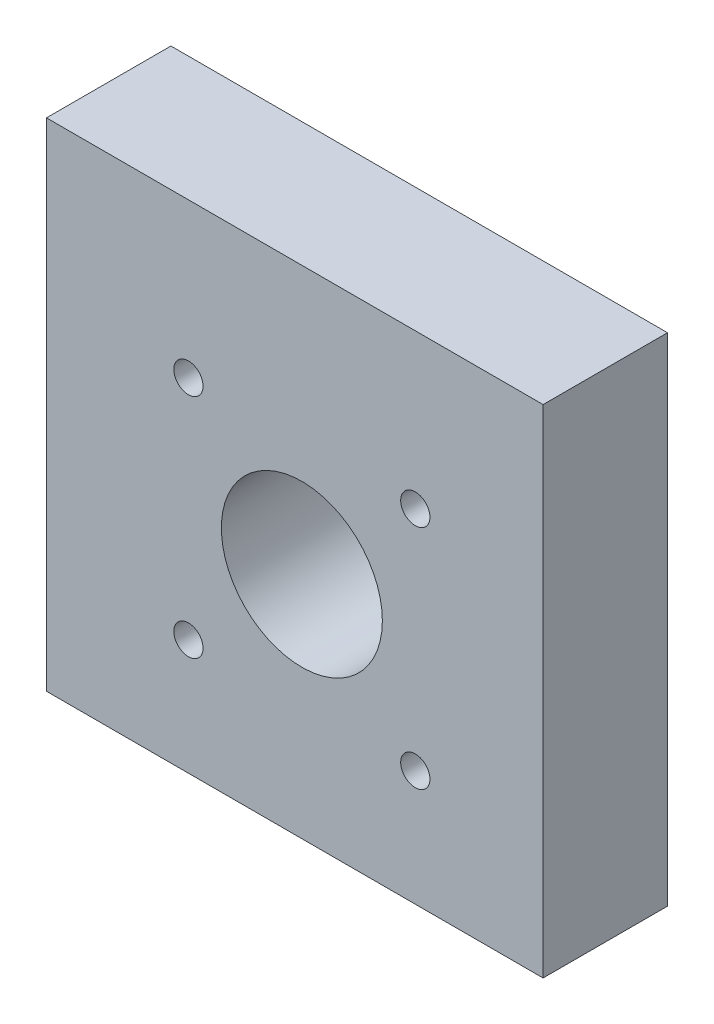
ISO-10303-21;
HEADER;
FILE_DESCRIPTION(('STEP AP214'),'2;1');
FILE_NAME('part.step','',(''),(''),'','','');
FILE_SCHEMA(('AUTOMOTIVE_DESIGN { 1 0 10303 214 1 1 1 1 }'));
ENDSEC;
DATA;
#1=APPLICATION_CONTEXT('core data for automotive mechanical design processes');
#2=APPLICATION_PROTOCOL_DEFINITION('international standard','automotive_design',2000,#1);
#3=PRODUCT_CONTEXT('',#1,'mechanical');
#4=PRODUCT('Part','Part','',(#3));
#5=PRODUCT_RELATED_PRODUCT_CATEGORY('part','',(#4));
#6=PRODUCT_DEFINITION_FORMATION('','',#4);
#7=PRODUCT_DEFINITION_CONTEXT('part definition',#1,'design');
#8=PRODUCT_DEFINITION('design','',#6,#7);
#9=PRODUCT_DEFINITION_SHAPE('','',#8);
#10=(LENGTH_UNIT() NAMED_UNIT(*) SI_UNIT(.MILLI.,.METRE.));
#11=(NAMED_UNIT(*) PLANE_ANGLE_UNIT() SI_UNIT($,.RADIAN.));
#12=(NAMED_UNIT(*) SI_UNIT($,.STERADIAN.) SOLID_ANGLE_UNIT());
#13=UNCERTAINTY_MEASURE_WITH_UNIT(LENGTH_MEASURE(1.E-05),#10,'distance_accuracy_value','');
#14=(GEOMETRIC_REPRESENTATION_CONTEXT(3) GLOBAL_UNCERTAINTY_ASSIGNED_CONTEXT((#13)) GLOBAL_UNIT_ASSIGNED_CONTEXT((#10,
#11,#12)) REPRESENTATION_CONTEXT('',''));
#15=CARTESIAN_POINT('',(0.,0.,0.));
#16=DIRECTION('',(0.,0.,1.));
#17=DIRECTION('',(1.,0.,0.));
#18=AXIS2_PLACEMENT_3D('',#15,#16,#17);
#19=CARTESIAN_POINT('',(-34.8929680603324,-31.2892721732176,-17.));
#20=DIRECTION('',(-1.,0.,0.));
#21=DIRECTION('',(0.,0.,1.));
#22=AXIS2_PLACEMENT_3D('',#19,#20,#21);
#23=PLANE('',#22);
#24=DIRECTION('',(0.,-1.,0.));
#25=VECTOR('',#24,1.);
#26=CARTESIAN_POINT('',(-34.8929680603324,-31.2892721732176,0.));
#27=LINE('',#26,#25);
#28=CARTESIAN_POINT('',(-34.8929680603324,36.5634296567981,0.));
#29=VERTEX_POINT('',#28);
#30=CARTESIAN_POINT('',(-34.8929680603324,-31.2892721732176,0.));
#31=VERTEX_POINT('',#30);
#32=EDGE_CURVE('E118',#29,#31,#27,.T.);
#33=ORIENTED_EDGE('',*,*,#32,.F.);
#34=DIRECTION('',(0.,0.,1.));
#35=VECTOR('',#34,1.);
#36=CARTESIAN_POINT('',(-34.8929680603324,36.5634296567981,-17.));
#37=LINE('',#36,#35);
#38=CARTESIAN_POINT('',(-34.8929680603324,36.5634296567981,-17.));
#39=VERTEX_POINT('',#38);
#40=EDGE_CURVE('E12',#39,#29,#37,.T.);
#41=ORIENTED_EDGE('',*,*,#40,.F.);
#42=DIRECTION('',(0.,-1.,0.));
#43=VECTOR('',#42,1.);
#44=CARTESIAN_POINT('',(-34.8929680603324,-31.2892721732176,-17.));
#45=LINE('',#44,#43);
#46=CARTESIAN_POINT('',(-34.8929680603324,-31.2892721732176,-17.));
#47=VERTEX_POINT('',#46);
#48=EDGE_CURVE('E109',#39,#47,#45,.T.);
#49=ORIENTED_EDGE('',*,*,#48,.T.);
#50=DIRECTION('',(0.,0.,1.));
#51=VECTOR('',#50,1.);
#52=CARTESIAN_POINT('',(-34.8929680603324,-31.2892721732176,-17.));
#53=LINE('',#52,#51);
#54=EDGE_CURVE('E50',#47,#31,#53,.T.);
#55=ORIENTED_EDGE('',*,*,#54,.T.);
#56=EDGE_LOOP('',(#33,#41,#49,#55));
#57=FACE_BOUND('',#56,.T.);
#58=ADVANCED_FACE('F47',(#57),#23,.T.);
#59=CARTESIAN_POINT('',(-34.8929680603324,36.5634296567981,-17.));
#60=DIRECTION('',(0.,1.,0.));
#61=DIRECTION('',(-1.,0.,0.));
#62=AXIS2_PLACEMENT_3D('',#59,#60,#61);
#63=PLANE('',#62);
#64=DIRECTION('',(-1.,0.,0.));
#65=VECTOR('',#64,1.);
#66=CARTESIAN_POINT('',(-34.8929680603324,36.5634296567981,0.));
#67=LINE('',#66,#65);
#68=CARTESIAN_POINT('',(32.9597337696832,36.563429656798,0.));
#69=VERTEX_POINT('',#68);
#70=EDGE_CURVE('E112',#69,#29,#67,.T.);
#71=ORIENTED_EDGE('',*,*,#70,.F.);
#72=DIRECTION('',(0.,0.,1.));
#73=VECTOR('',#72,1.);
#74=CARTESIAN_POINT('',(32.9597337696832,36.563429656798,-17.));
#75=LINE('',#74,#73);
#76=CARTESIAN_POINT('',(32.9597337696832,36.563429656798,-17.));
#77=VERTEX_POINT('',#76);
#78=EDGE_CURVE('E57',#77,#69,#75,.T.);
#79=ORIENTED_EDGE('',*,*,#78,.F.);
#80=DIRECTION('',(-1.,0.,0.));
#81=VECTOR('',#80,1.);
#82=CARTESIAN_POINT('',(-34.8929680603324,36.5634296567981,-17.));
#83=LINE('',#82,#81);
#84=EDGE_CURVE('E104',#77,#39,#83,.T.);
#85=ORIENTED_EDGE('',*,*,#84,.T.);
#86=ORIENTED_EDGE('',*,*,#40,.T.);
#87=EDGE_LOOP('',(#71,#79,#85,#86));
#88=FACE_BOUND('',#87,.T.);
#89=ADVANCED_FACE('F142',(#88),#63,.T.);
#90=CARTESIAN_POINT('',(32.9597337696832,36.563429656798,-17.));
#91=DIRECTION('',(1.,0.,0.));
#92=DIRECTION('',(0.,0.,-1.));
#93=AXIS2_PLACEMENT_3D('',#90,#91,#92);
#94=PLANE('',#93);
#95=DIRECTION('',(0.,1.,0.));
#96=VECTOR('',#95,1.);
#97=CARTESIAN_POINT('',(32.9597337696832,36.563429656798,0.));
#98=LINE('',#97,#96);
#99=CARTESIAN_POINT('',(32.9597337696832,-31.2892721732177,0.));
#100=VERTEX_POINT('',#99);
#101=EDGE_CURVE('E98',#100,#69,#98,.T.);
#102=ORIENTED_EDGE('',*,*,#101,.F.);
#103=DIRECTION('',(0.,0.,1.));
#104=VECTOR('',#103,1.);
#105=CARTESIAN_POINT('',(32.9597337696832,-31.2892721732177,-17.));
#106=LINE('',#105,#104);
#107=CARTESIAN_POINT('',(32.9597337696832,-31.2892721732177,-17.));
#108=VERTEX_POINT('',#107);
#109=EDGE_CURVE('E93',#108,#100,#106,.T.);
#110=ORIENTED_EDGE('',*,*,#109,.F.);
#111=DIRECTION('',(0.,1.,0.));
#112=VECTOR('',#111,1.);
#113=CARTESIAN_POINT('',(32.9597337696832,36.563429656798,-17.));
#114=LINE('',#113,#112);
#115=EDGE_CURVE('E96',#108,#77,#114,.T.);
#116=ORIENTED_EDGE('',*,*,#115,.T.);
#117=ORIENTED_EDGE('',*,*,#78,.T.);
#118=EDGE_LOOP('',(#102,#110,#116,#117));
#119=FACE_BOUND('',#118,.T.);
#120=ADVANCED_FACE('F95',(#119),#94,.T.);
#121=CARTESIAN_POINT('',(32.9597337696832,-31.2892721732177,-17.));
#122=DIRECTION('',(0.,-1.,0.));
#123=DIRECTION('',(1.,0.,0.));
#124=AXIS2_PLACEMENT_3D('',#121,#122,#123);
#125=PLANE('',#124);
#126=DIRECTION('',(1.,0.,0.));
#127=VECTOR('',#126,1.);
#128=CARTESIAN_POINT('',(32.9597337696832,-31.2892721732177,0.));
#129=LINE('',#128,#127);
#130=EDGE_CURVE('E123',#31,#100,#129,.T.);
#131=ORIENTED_EDGE('',*,*,#130,.F.);
#132=ORIENTED_EDGE('',*,*,#54,.F.);
#133=DIRECTION('',(1.,0.,0.));
#134=VECTOR('',#133,1.);
#135=CARTESIAN_POINT('',(32.9597337696832,-31.2892721732177,-17.));
#136=LINE('',#135,#134);
#137=EDGE_CURVE('E103',#47,#108,#136,.T.);
#138=ORIENTED_EDGE('',*,*,#137,.T.);
#139=ORIENTED_EDGE('',*,*,#109,.T.);
#140=EDGE_LOOP('',(#131,#132,#138,#139));
#141=FACE_BOUND('',#140,.T.);
#142=ADVANCED_FACE('F107',(#141),#125,.T.);
#143=CARTESIAN_POINT('',(0.,0.,-17.));
#144=DIRECTION('',(0.,0.,-1.));
#145=DIRECTION('',(-1.,0.,0.));
#146=AXIS2_PLACEMENT_3D('',#143,#144,#145);
#147=PLANE('',#146);
#148=CARTESIAN_POINT('',(15.5000000000002,15.5000000000002,-17.));
#149=DIRECTION('',(0.,0.,1.));
#150=DIRECTION('',(1.,0.,0.));
#151=AXIS2_PLACEMENT_3D('',#148,#149,#150);
#152=CIRCLE('',#151,2.);
#153=CARTESIAN_POINT('',(17.5000000000002,15.5000000000002,-17.));
#154=VERTEX_POINT('',#153);
#155=EDGE_CURVE('E202',#154,#154,#152,.T.);
#156=ORIENTED_EDGE('',*,*,#155,.T.);
#157=EDGE_LOOP('',(#156));
#158=FACE_BOUND('',#157,.T.);
#159=CARTESIAN_POINT('',(-15.5000000000002,-15.4999999999999,-17.));
#160=DIRECTION('',(0.,0.,1.));
#161=DIRECTION('',(1.,0.,0.));
#162=AXIS2_PLACEMENT_3D('',#159,#160,#161);
#163=CIRCLE('',#162,2.);
#164=CARTESIAN_POINT('',(-13.5000000000002,-15.4999999999999,-17.));
#165=VERTEX_POINT('',#164);
#166=EDGE_CURVE('E216',#165,#165,#163,.T.);
#167=ORIENTED_EDGE('',*,*,#166,.T.);
#168=EDGE_LOOP('',(#167));
#169=FACE_BOUND('',#168,.T.);
#170=CARTESIAN_POINT('',(15.5,-15.5,-17.));
#171=DIRECTION('',(0.,0.,1.));
#172=DIRECTION('',(1.,0.,0.));
#173=AXIS2_PLACEMENT_3D('',#170,#171,#172);
#174=CIRCLE('',#173,2.);
#175=CARTESIAN_POINT('',(17.5,-15.5,-17.));
#176=VERTEX_POINT('',#175);
#177=EDGE_CURVE('E189',#176,#176,#174,.T.);
#178=ORIENTED_EDGE('',*,*,#177,.T.);
#179=EDGE_LOOP('',(#178));
#180=FACE_BOUND('',#179,.T.);
#181=CARTESIAN_POINT('',(-15.5,15.5000000000002,-17.));
#182=DIRECTION('',(0.,0.,1.));
#183=DIRECTION('',(1.,0.,0.));
#184=AXIS2_PLACEMENT_3D('',#181,#182,#183);
#185=CIRCLE('',#184,2.);
#186=CARTESIAN_POINT('',(-13.5,15.5000000000002,-17.));
#187=VERTEX_POINT('',#186);
#188=EDGE_CURVE('E227',#187,#187,#185,.T.);
#189=ORIENTED_EDGE('',*,*,#188,.T.);
#190=EDGE_LOOP('',(#189));
#191=FACE_BOUND('',#190,.T.);
#192=CARTESIAN_POINT('',(0.,0.,-17.));
#193=DIRECTION('',(0.,0.,1.));
#194=DIRECTION('',(1.,0.,0.));
#195=AXIS2_PLACEMENT_3D('',#192,#193,#194);
#196=CIRCLE('',#195,11.);
#197=CARTESIAN_POINT('',(11.,0.,-17.));
#198=VERTEX_POINT('',#197);
#199=EDGE_CURVE('E124',#198,#198,#196,.T.);
#200=ORIENTED_EDGE('',*,*,#199,.T.);
#201=EDGE_LOOP('',(#200));
#202=FACE_BOUND('',#201,.T.);
#203=ORIENTED_EDGE('',*,*,#48,.F.);
#204=ORIENTED_EDGE('',*,*,#84,.F.);
#205=ORIENTED_EDGE('',*,*,#115,.F.);
#206=ORIENTED_EDGE('',*,*,#137,.F.);
#207=EDGE_LOOP('',(#203,#204,#205,#206));
#208=FACE_BOUND('',#207,.T.);
#209=ADVANCED_FACE('F102',(#158,#169,#180,#191,#202,#208),#147,.T.);
#210=CARTESIAN_POINT('',(0.,0.,0.));
#211=DIRECTION('',(0.,0.,-1.));
#212=DIRECTION('',(-1.,0.,0.));
#213=AXIS2_PLACEMENT_3D('',#210,#211,#212);
#214=PLANE('',#213);
#215=CARTESIAN_POINT('',(15.5000000000002,15.5000000000002,0.));
#216=DIRECTION('',(0.,0.,1.));
#217=DIRECTION('',(1.,0.,0.));
#218=AXIS2_PLACEMENT_3D('',#215,#216,#217);
#219=CIRCLE('',#218,2.);
#220=CARTESIAN_POINT('',(17.5000000000002,15.5000000000002,0.));
#221=VERTEX_POINT('',#220);
#222=EDGE_CURVE('E211',#221,#221,#219,.T.);
#223=ORIENTED_EDGE('',*,*,#222,.F.);
#224=EDGE_LOOP('',(#223));
#225=FACE_BOUND('',#224,.T.);
#226=CARTESIAN_POINT('',(-15.5000000000002,-15.4999999999999,0.));
#227=DIRECTION('',(0.,0.,1.));
#228=DIRECTION('',(1.,0.,0.));
#229=AXIS2_PLACEMENT_3D('',#226,#227,#228);
#230=CIRCLE('',#229,2.);
#231=CARTESIAN_POINT('',(-13.5000000000002,-15.4999999999999,0.));
#232=VERTEX_POINT('',#231);
#233=EDGE_CURVE('E197',#232,#232,#230,.T.);
#234=ORIENTED_EDGE('',*,*,#233,.F.);
#235=EDGE_LOOP('',(#234));
#236=FACE_BOUND('',#235,.T.);
#237=CARTESIAN_POINT('',(15.5,-15.5,0.));
#238=DIRECTION('',(0.,0.,1.));
#239=DIRECTION('',(1.,0.,0.));
#240=AXIS2_PLACEMENT_3D('',#237,#238,#239);
#241=CIRCLE('',#240,2.);
#242=CARTESIAN_POINT('',(17.5,-15.5,0.));
#243=VERTEX_POINT('',#242);
#244=EDGE_CURVE('E192',#243,#243,#241,.T.);
#245=ORIENTED_EDGE('',*,*,#244,.F.);
#246=EDGE_LOOP('',(#245));
#247=FACE_BOUND('',#246,.T.);
#248=CARTESIAN_POINT('',(-15.5,15.5000000000002,0.));
#249=DIRECTION('',(0.,0.,1.));
#250=DIRECTION('',(1.,0.,0.));
#251=AXIS2_PLACEMENT_3D('',#248,#249,#250);
#252=CIRCLE('',#251,2.);
#253=CARTESIAN_POINT('',(-13.5,15.5000000000002,0.));
#254=VERTEX_POINT('',#253);
#255=EDGE_CURVE('E232',#254,#254,#252,.T.);
#256=ORIENTED_EDGE('',*,*,#255,.F.);
#257=EDGE_LOOP('',(#256));
#258=FACE_BOUND('',#257,.T.);
#259=CARTESIAN_POINT('',(0.,0.,0.));
#260=DIRECTION('',(0.,0.,1.));
#261=DIRECTION('',(1.,0.,0.));
#262=AXIS2_PLACEMENT_3D('',#259,#260,#261);
#263=CIRCLE('',#262,11.);
#264=CARTESIAN_POINT('',(11.,0.,0.));
#265=VERTEX_POINT('',#264);
#266=EDGE_CURVE('E231',#265,#265,#263,.T.);
#267=ORIENTED_EDGE('',*,*,#266,.F.);
#268=EDGE_LOOP('',(#267));
#269=FACE_BOUND('',#268,.T.);
#270=ORIENTED_EDGE('',*,*,#32,.T.);
#271=ORIENTED_EDGE('',*,*,#130,.T.);
#272=ORIENTED_EDGE('',*,*,#101,.T.);
#273=ORIENTED_EDGE('',*,*,#70,.T.);
#274=EDGE_LOOP('',(#270,#271,#272,#273));
#275=FACE_BOUND('',#274,.T.);
#276=ADVANCED_FACE('F141',(#225,#236,#247,#258,#269,#275),#214,.F.);
#277=CARTESIAN_POINT('',(0.,0.,-17.));
#278=DIRECTION('',(0.,0.,1.));
#279=DIRECTION('',(1.,0.,0.));
#280=AXIS2_PLACEMENT_3D('',#277,#278,#279);
#281=CYLINDRICAL_SURFACE('',#280,11.);
#282=ORIENTED_EDGE('',*,*,#199,.F.);
#283=EDGE_LOOP('',(#282));
#284=FACE_BOUND('',#283,.T.);
#285=ORIENTED_EDGE('',*,*,#266,.T.);
#286=EDGE_LOOP('',(#285));
#287=FACE_BOUND('',#286,.T.);
#288=ADVANCED_FACE('F160',(#284,#287),#281,.F.);
#289=CARTESIAN_POINT('',(-15.5,15.5000000000002,-17.));
#290=DIRECTION('',(0.,0.,1.));
#291=DIRECTION('',(1.,0.,0.));
#292=AXIS2_PLACEMENT_3D('',#289,#290,#291);
#293=CYLINDRICAL_SURFACE('',#292,2.);
#294=ORIENTED_EDGE('',*,*,#188,.F.);
#295=EDGE_LOOP('',(#294));
#296=FACE_BOUND('',#295,.T.);
#297=ORIENTED_EDGE('',*,*,#255,.T.);
#298=EDGE_LOOP('',(#297));
#299=FACE_BOUND('',#298,.T.);
#300=ADVANCED_FACE('F168',(#296,#299),#293,.F.);
#301=CARTESIAN_POINT('',(15.5,-15.5,-17.));
#302=DIRECTION('',(0.,0.,1.));
#303=DIRECTION('',(1.,0.,0.));
#304=AXIS2_PLACEMENT_3D('',#301,#302,#303);
#305=CYLINDRICAL_SURFACE('',#304,2.);
#306=ORIENTED_EDGE('',*,*,#177,.F.);
#307=EDGE_LOOP('',(#306));
#308=FACE_BOUND('',#307,.T.);
#309=ORIENTED_EDGE('',*,*,#244,.T.);
#310=EDGE_LOOP('',(#309));
#311=FACE_BOUND('',#310,.T.);
#312=ADVANCED_FACE('F172',(#308,#311),#305,.F.);
#313=CARTESIAN_POINT('',(-15.5000000000002,-15.4999999999999,-17.));
#314=DIRECTION('',(0.,0.,1.));
#315=DIRECTION('',(1.,0.,0.));
#316=AXIS2_PLACEMENT_3D('',#313,#314,#315);
#317=CYLINDRICAL_SURFACE('',#316,2.);
#318=ORIENTED_EDGE('',*,*,#166,.F.);
#319=EDGE_LOOP('',(#318));
#320=FACE_BOUND('',#319,.T.);
#321=ORIENTED_EDGE('',*,*,#233,.T.);
#322=EDGE_LOOP('',(#321));
#323=FACE_BOUND('',#322,.T.);
#324=ADVANCED_FACE('F174',(#320,#323),#317,.F.);
#325=CARTESIAN_POINT('',(15.5000000000002,15.5000000000002,-17.));
#326=DIRECTION('',(0.,0.,1.));
#327=DIRECTION('',(1.,0.,0.));
#328=AXIS2_PLACEMENT_3D('',#325,#326,#327);
#329=CYLINDRICAL_SURFACE('',#328,2.);
#330=ORIENTED_EDGE('',*,*,#155,.F.);
#331=EDGE_LOOP('',(#330));
#332=FACE_BOUND('',#331,.T.);
#333=ORIENTED_EDGE('',*,*,#222,.T.);
#334=EDGE_LOOP('',(#333));
#335=FACE_BOUND('',#334,.T.);
#336=ADVANCED_FACE('F177',(#332,#335),#329,.F.);
#337=CLOSED_SHELL('',(#58,#89,#120,#142,#209,#276,#288,#300,#312,#324,#336));
#338=MANIFOLD_SOLID_BREP('B2',#337);
#339=ADVANCED_BREP_SHAPE_REPRESENTATION('',(#18,#338),#14);
#340=SHAPE_DEFINITION_REPRESENTATION(#9,#339);
ENDSEC;
END-ISO-10303-21;
